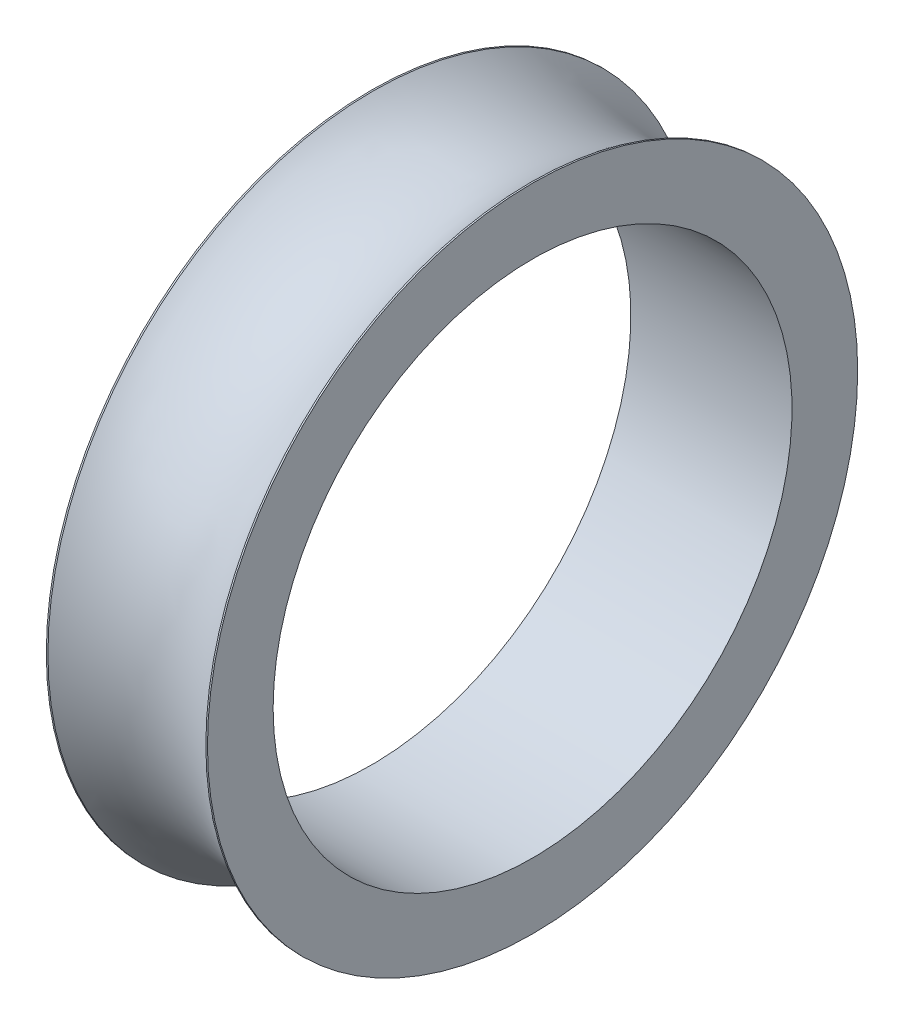
ISO-10303-21;
HEADER;
FILE_DESCRIPTION(('STEP AP214'),'2;1');
FILE_NAME('part.step','',(''),(''),'','','');
FILE_SCHEMA(('AUTOMOTIVE_DESIGN { 1 0 10303 214 1 1 1 1 }'));
ENDSEC;
DATA;
#1=APPLICATION_CONTEXT('core data for automotive mechanical design processes');
#2=APPLICATION_PROTOCOL_DEFINITION('international standard','automotive_design',2000,#1);
#3=PRODUCT_CONTEXT('',#1,'mechanical');
#4=PRODUCT('Part','Part','',(#3));
#5=PRODUCT_RELATED_PRODUCT_CATEGORY('part','',(#4));
#6=PRODUCT_DEFINITION_FORMATION('','',#4);
#7=PRODUCT_DEFINITION_CONTEXT('part definition',#1,'design');
#8=PRODUCT_DEFINITION('design','',#6,#7);
#9=PRODUCT_DEFINITION_SHAPE('','',#8);
#10=(LENGTH_UNIT() NAMED_UNIT(*) SI_UNIT(.MILLI.,.METRE.));
#11=(NAMED_UNIT(*) PLANE_ANGLE_UNIT() SI_UNIT($,.RADIAN.));
#12=(NAMED_UNIT(*) SI_UNIT($,.STERADIAN.) SOLID_ANGLE_UNIT());
#13=UNCERTAINTY_MEASURE_WITH_UNIT(LENGTH_MEASURE(1.E-05),#10,'distance_accuracy_value','');
#14=(GEOMETRIC_REPRESENTATION_CONTEXT(3) GLOBAL_UNCERTAINTY_ASSIGNED_CONTEXT((#13)) GLOBAL_UNIT_ASSIGNED_CONTEXT((#10,
#11,#12)) REPRESENTATION_CONTEXT('',''));
#15=CARTESIAN_POINT('',(0.,0.,0.));
#16=DIRECTION('',(0.,0.,1.));
#17=DIRECTION('',(1.,0.,0.));
#18=AXIS2_PLACEMENT_3D('',#15,#16,#17);
#19=CARTESIAN_POINT('',(2.5,-3.16188235075248,0.));
#20=DIRECTION('',(-1.,0.,0.));
#21=DIRECTION('',(0.,0.,1.));
#22=AXIS2_PLACEMENT_3D('',#19,#20,#21);
#23=PLANE('',#22);
#24=CARTESIAN_POINT('',(2.5,-13.25,0.));
#25=DIRECTION('',(-1.,0.,0.));
#26=DIRECTION('',(0.,0.,1.));
#27=AXIS2_PLACEMENT_3D('',#24,#25,#26);
#28=CIRCLE('',#27,10.0881176492475);
#29=CARTESIAN_POINT('',(2.5,-13.25,10.0881176492475));
#30=VERTEX_POINT('',#29);
#31=EDGE_CURVE('E11',#30,#30,#28,.T.);
#32=ORIENTED_EDGE('',*,*,#31,.F.);
#33=EDGE_LOOP('',(#32));
#34=FACE_BOUND('',#33,.T.);
#35=CARTESIAN_POINT('',(2.5,-13.25,0.));
#36=DIRECTION('',(-1.,0.,0.));
#37=DIRECTION('',(0.,0.,1.));
#38=AXIS2_PLACEMENT_3D('',#35,#36,#37);
#39=CIRCLE('',#38,8.05);
#40=CARTESIAN_POINT('',(2.5,-13.25,8.05));
#41=VERTEX_POINT('',#40);
#42=EDGE_CURVE('E56',#41,#41,#39,.T.);
#43=ORIENTED_EDGE('',*,*,#42,.T.);
#44=EDGE_LOOP('',(#43));
#45=FACE_BOUND('',#44,.T.);
#46=ADVANCED_FACE('F34',(#34,#45),#23,.F.);
#47=CARTESIAN_POINT('',(-2.5,-13.25,0.));
#48=DIRECTION('',(-1.,0.,0.));
#49=DIRECTION('',(0.,0.,1.));
#50=AXIS2_PLACEMENT_3D('',#47,#48,#49);
#51=CYLINDRICAL_SURFACE('',#50,10.0881176492475);
#52=CARTESIAN_POINT('',(2.45,-13.25,0.));
#53=DIRECTION('',(-1.,0.,0.));
#54=DIRECTION('',(0.,0.,1.));
#55=AXIS2_PLACEMENT_3D('',#52,#53,#54);
#56=CIRCLE('',#55,10.0881176492475);
#57=CARTESIAN_POINT('',(2.45,-13.25,10.0881176492475));
#58=VERTEX_POINT('',#57);
#59=EDGE_CURVE('E40',#58,#58,#56,.T.);
#60=ORIENTED_EDGE('',*,*,#59,.F.);
#61=EDGE_LOOP('',(#60));
#62=FACE_BOUND('',#61,.T.);
#63=ORIENTED_EDGE('',*,*,#31,.T.);
#64=EDGE_LOOP('',(#63));
#65=FACE_BOUND('',#64,.T.);
#66=ADVANCED_FACE('F81',(#62,#65),#51,.T.);
#67=CARTESIAN_POINT('',(0.,-13.25,0.));
#68=DIRECTION('',(-1.,0.,0.));
#69=DIRECTION('',(0.,0.,1.));
#70=AXIS2_PLACEMENT_3D('',#67,#68,#69);
#71=TOROIDAL_SURFACE('',#70,13.25,4.);
#72=CARTESIAN_POINT('',(-2.45,-13.25,0.));
#73=DIRECTION('',(-1.,0.,0.));
#74=DIRECTION('',(0.,0.,1.));
#75=AXIS2_PLACEMENT_3D('',#72,#73,#74);
#76=CIRCLE('',#75,10.0881176492475);
#77=CARTESIAN_POINT('',(-2.45,-13.25,10.0881176492475));
#78=VERTEX_POINT('',#77);
#79=EDGE_CURVE('E44',#78,#78,#76,.T.);
#80=ORIENTED_EDGE('',*,*,#79,.F.);
#81=EDGE_LOOP('',(#80));
#82=FACE_BOUND('',#81,.T.);
#83=ORIENTED_EDGE('',*,*,#59,.T.);
#84=EDGE_LOOP('',(#83));
#85=FACE_BOUND('',#84,.T.);
#86=ADVANCED_FACE('F76',(#82,#85),#71,.F.);
#87=CARTESIAN_POINT('',(-2.5,-13.25,0.));
#88=DIRECTION('',(-1.,0.,0.));
#89=DIRECTION('',(0.,0.,1.));
#90=AXIS2_PLACEMENT_3D('',#87,#88,#89);
#91=CYLINDRICAL_SURFACE('',#90,10.0881176492475);
#92=CARTESIAN_POINT('',(-2.5,-13.25,0.));
#93=DIRECTION('',(-1.,0.,0.));
#94=DIRECTION('',(0.,0.,1.));
#95=AXIS2_PLACEMENT_3D('',#92,#93,#94);
#96=CIRCLE('',#95,10.0881176492475);
#97=CARTESIAN_POINT('',(-2.5,-13.25,10.0881176492475));
#98=VERTEX_POINT('',#97);
#99=EDGE_CURVE('E48',#98,#98,#96,.T.);
#100=ORIENTED_EDGE('',*,*,#99,.F.);
#101=EDGE_LOOP('',(#100));
#102=FACE_BOUND('',#101,.T.);
#103=ORIENTED_EDGE('',*,*,#79,.T.);
#104=EDGE_LOOP('',(#103));
#105=FACE_BOUND('',#104,.T.);
#106=ADVANCED_FACE('F70',(#102,#105),#91,.T.);
#107=CARTESIAN_POINT('',(-2.5,-3.16188235075248,0.));
#108=DIRECTION('',(1.,0.,0.));
#109=DIRECTION('',(0.,0.,-1.));
#110=AXIS2_PLACEMENT_3D('',#107,#108,#109);
#111=PLANE('',#110);
#112=CARTESIAN_POINT('',(-2.5,-13.25,0.));
#113=DIRECTION('',(-1.,0.,0.));
#114=DIRECTION('',(0.,0.,1.));
#115=AXIS2_PLACEMENT_3D('',#112,#113,#114);
#116=CIRCLE('',#115,8.05);
#117=CARTESIAN_POINT('',(-2.5,-13.25,8.05));
#118=VERTEX_POINT('',#117);
#119=EDGE_CURVE('E53',#118,#118,#116,.T.);
#120=ORIENTED_EDGE('',*,*,#119,.F.);
#121=EDGE_LOOP('',(#120));
#122=FACE_BOUND('',#121,.T.);
#123=ORIENTED_EDGE('',*,*,#99,.T.);
#124=EDGE_LOOP('',(#123));
#125=FACE_BOUND('',#124,.T.);
#126=ADVANCED_FACE('F64',(#122,#125),#111,.F.);
#127=CARTESIAN_POINT('',(-2.5,-13.25,0.));
#128=DIRECTION('',(-1.,0.,0.));
#129=DIRECTION('',(0.,0.,1.));
#130=AXIS2_PLACEMENT_3D('',#127,#128,#129);
#131=CYLINDRICAL_SURFACE('',#130,8.05);
#132=ORIENTED_EDGE('',*,*,#42,.F.);
#133=EDGE_LOOP('',(#132));
#134=FACE_BOUND('',#133,.T.);
#135=ORIENTED_EDGE('',*,*,#119,.T.);
#136=EDGE_LOOP('',(#135));
#137=FACE_BOUND('',#136,.T.);
#138=ADVANCED_FACE('F61',(#134,#137),#131,.F.);
#139=CLOSED_SHELL('',(#46,#66,#86,#106,#126,#138));
#140=MANIFOLD_SOLID_BREP('B2',#139);
#141=ADVANCED_BREP_SHAPE_REPRESENTATION('',(#18,#140),#14);
#142=SHAPE_DEFINITION_REPRESENTATION(#9,#141);
ENDSEC;
END-ISO-10303-21;
